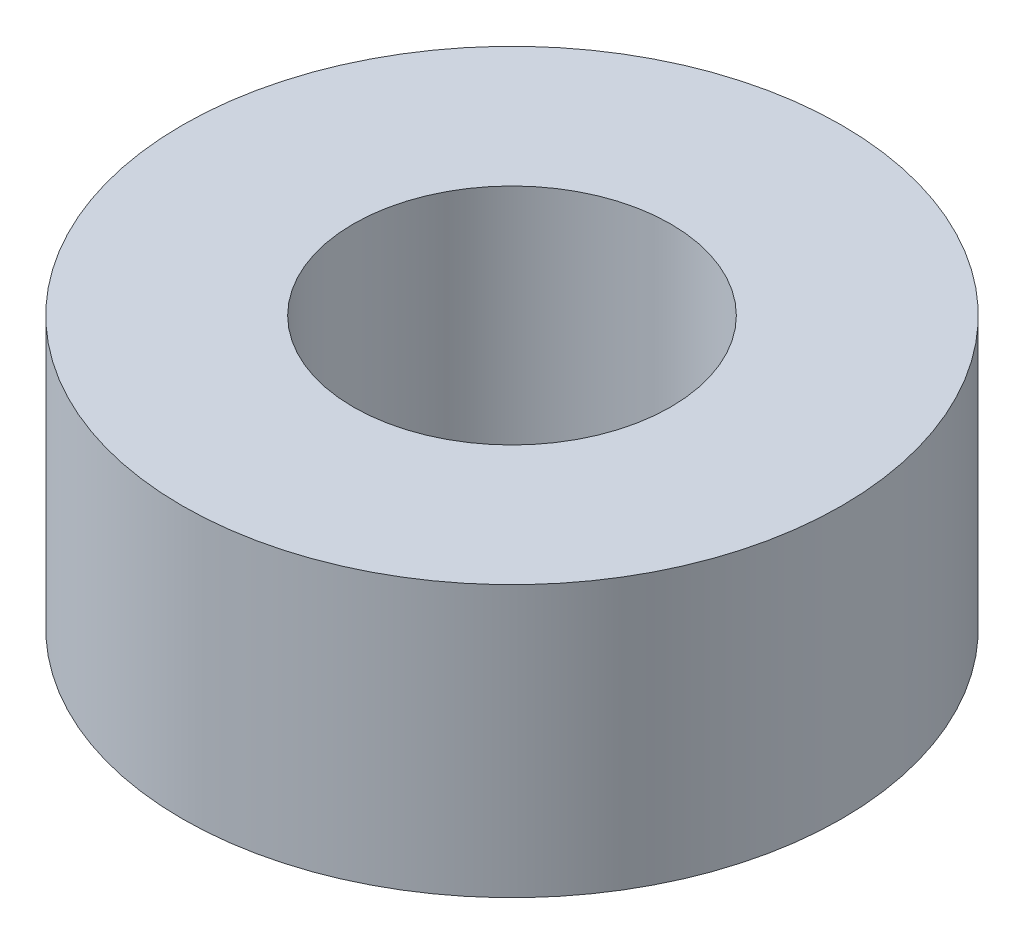
ISO-10303-21;
HEADER;
FILE_DESCRIPTION(('STEP AP214'),'2;1');
FILE_NAME('part.step','',(''),(''),'','','');
FILE_SCHEMA(('AUTOMOTIVE_DESIGN { 1 0 10303 214 1 1 1 1 }'));
ENDSEC;
DATA;
#1=APPLICATION_CONTEXT('core data for automotive mechanical design processes');
#2=APPLICATION_PROTOCOL_DEFINITION('international standard','automotive_design',2000,#1);
#3=PRODUCT_CONTEXT('',#1,'mechanical');
#4=PRODUCT('Part','Part','',(#3));
#5=PRODUCT_RELATED_PRODUCT_CATEGORY('part','',(#4));
#6=PRODUCT_DEFINITION_FORMATION('','',#4);
#7=PRODUCT_DEFINITION_CONTEXT('part definition',#1,'design');
#8=PRODUCT_DEFINITION('design','',#6,#7);
#9=PRODUCT_DEFINITION_SHAPE('','',#8);
#10=(LENGTH_UNIT() NAMED_UNIT(*) SI_UNIT(.MILLI.,.METRE.));
#11=(NAMED_UNIT(*) PLANE_ANGLE_UNIT() SI_UNIT($,.RADIAN.));
#12=(NAMED_UNIT(*) SI_UNIT($,.STERADIAN.) SOLID_ANGLE_UNIT());
#13=UNCERTAINTY_MEASURE_WITH_UNIT(LENGTH_MEASURE(1.E-05),#10,'distance_accuracy_value','');
#14=(GEOMETRIC_REPRESENTATION_CONTEXT(3) GLOBAL_UNCERTAINTY_ASSIGNED_CONTEXT((#13)) GLOBAL_UNIT_ASSIGNED_CONTEXT((#10,
#11,#12)) REPRESENTATION_CONTEXT('',''));
#15=CARTESIAN_POINT('',(0.,0.,0.));
#16=DIRECTION('',(0.,0.,1.));
#17=DIRECTION('',(1.,0.,0.));
#18=AXIS2_PLACEMENT_3D('',#15,#16,#17);
#19=CARTESIAN_POINT('',(0.,4.699,0.));
#20=DIRECTION('',(0.,1.,0.));
#21=DIRECTION('',(0.,0.,1.));
#22=AXIS2_PLACEMENT_3D('',#19,#20,#21);
#23=PLANE('',#22);
#24=CARTESIAN_POINT('',(0.,4.699,0.));
#25=DIRECTION('',(0.,1.,0.));
#26=DIRECTION('',(0.,0.,1.));
#27=AXIS2_PLACEMENT_3D('',#24,#25,#26);
#28=CIRCLE('',#27,5.715);
#29=CARTESIAN_POINT('',(0.,4.699,5.715));
#30=VERTEX_POINT('',#29);
#31=EDGE_CURVE('E10',#30,#30,#28,.T.);
#32=ORIENTED_EDGE('',*,*,#31,.T.);
#33=EDGE_LOOP('',(#32));
#34=FACE_BOUND('',#33,.T.);
#35=CARTESIAN_POINT('',(0.,4.699,0.));
#36=DIRECTION('',(0.,1.,0.));
#37=DIRECTION('',(0.,0.,1.));
#38=AXIS2_PLACEMENT_3D('',#35,#36,#37);
#39=CIRCLE('',#38,2.75);
#40=CARTESIAN_POINT('',(0.,4.699,2.75));
#41=VERTEX_POINT('',#40);
#42=EDGE_CURVE('E56',#41,#41,#39,.T.);
#43=ORIENTED_EDGE('',*,*,#42,.F.);
#44=EDGE_LOOP('',(#43));
#45=FACE_BOUND('',#44,.T.);
#46=ADVANCED_FACE('F43',(#34,#45),#23,.T.);
#47=CARTESIAN_POINT('',(0.,0.,0.));
#48=DIRECTION('',(0.,1.,0.));
#49=DIRECTION('',(0.,0.,1.));
#50=AXIS2_PLACEMENT_3D('',#47,#48,#49);
#51=PLANE('',#50);
#52=CARTESIAN_POINT('',(0.,0.,0.));
#53=DIRECTION('',(0.,1.,0.));
#54=DIRECTION('',(0.,0.,1.));
#55=AXIS2_PLACEMENT_3D('',#52,#53,#54);
#56=CIRCLE('',#55,5.715);
#57=CARTESIAN_POINT('',(0.,0.,5.715));
#58=VERTEX_POINT('',#57);
#59=EDGE_CURVE('E47',#58,#58,#56,.T.);
#60=ORIENTED_EDGE('',*,*,#59,.F.);
#61=EDGE_LOOP('',(#60));
#62=FACE_BOUND('',#61,.T.);
#63=CARTESIAN_POINT('',(0.,0.,0.));
#64=DIRECTION('',(0.,1.,0.));
#65=DIRECTION('',(0.,0.,1.));
#66=AXIS2_PLACEMENT_3D('',#63,#64,#65);
#67=CIRCLE('',#66,2.75);
#68=CARTESIAN_POINT('',(0.,0.,2.75));
#69=VERTEX_POINT('',#68);
#70=EDGE_CURVE('E58',#69,#69,#67,.T.);
#71=ORIENTED_EDGE('',*,*,#70,.T.);
#72=EDGE_LOOP('',(#71));
#73=FACE_BOUND('',#72,.T.);
#74=ADVANCED_FACE('F70',(#62,#73),#51,.F.);
#75=CARTESIAN_POINT('',(0.,4.699,0.));
#76=DIRECTION('',(0.,-1.,0.));
#77=DIRECTION('',(0.,0.,-1.));
#78=AXIS2_PLACEMENT_3D('',#75,#76,#77);
#79=CYLINDRICAL_SURFACE('',#78,5.715);
#80=ORIENTED_EDGE('',*,*,#31,.F.);
#81=EDGE_LOOP('',(#80));
#82=FACE_BOUND('',#81,.T.);
#83=ORIENTED_EDGE('',*,*,#59,.T.);
#84=EDGE_LOOP('',(#83));
#85=FACE_BOUND('',#84,.T.);
#86=ADVANCED_FACE('F45',(#82,#85),#79,.T.);
#87=CARTESIAN_POINT('',(0.,4.699,0.));
#88=DIRECTION('',(0.,-1.,0.));
#89=DIRECTION('',(0.,0.,-1.));
#90=AXIS2_PLACEMENT_3D('',#87,#88,#89);
#91=CYLINDRICAL_SURFACE('',#90,2.75);
#92=ORIENTED_EDGE('',*,*,#42,.T.);
#93=EDGE_LOOP('',(#92));
#94=FACE_BOUND('',#93,.T.);
#95=ORIENTED_EDGE('',*,*,#70,.F.);
#96=EDGE_LOOP('',(#95));
#97=FACE_BOUND('',#96,.T.);
#98=ADVANCED_FACE('F66',(#94,#97),#91,.F.);
#99=CLOSED_SHELL('',(#46,#74,#86,#98));
#100=MANIFOLD_SOLID_BREP('B2',#99);
#101=ADVANCED_BREP_SHAPE_REPRESENTATION('',(#18,#100),#14);
#102=SHAPE_DEFINITION_REPRESENTATION(#9,#101);
ENDSEC;
END-ISO-10303-21;
